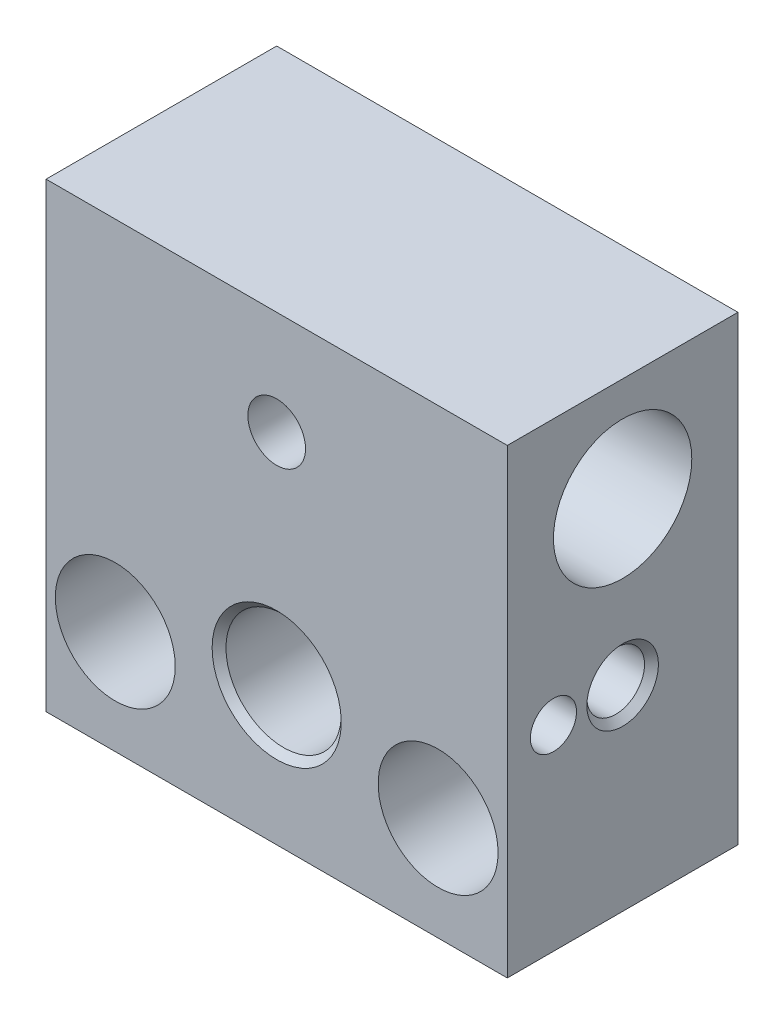
ISO-10303-21;
HEADER;
FILE_DESCRIPTION(('STEP AP214'),'2;1');
FILE_NAME('part.step','',(''),(''),'','','');
FILE_SCHEMA(('AUTOMOTIVE_DESIGN { 1 0 10303 214 1 1 1 1 }'));
ENDSEC;
DATA;
#1=APPLICATION_CONTEXT('core data for automotive mechanical design processes');
#2=APPLICATION_PROTOCOL_DEFINITION('international standard','automotive_design',2000,#1);
#3=PRODUCT_CONTEXT('',#1,'mechanical');
#4=PRODUCT('Part','Part','',(#3));
#5=PRODUCT_RELATED_PRODUCT_CATEGORY('part','',(#4));
#6=PRODUCT_DEFINITION_FORMATION('','',#4);
#7=PRODUCT_DEFINITION_CONTEXT('part definition',#1,'design');
#8=PRODUCT_DEFINITION('design','',#6,#7);
#9=PRODUCT_DEFINITION_SHAPE('','',#8);
#10=(LENGTH_UNIT() NAMED_UNIT(*) SI_UNIT(.MILLI.,.METRE.));
#11=(NAMED_UNIT(*) PLANE_ANGLE_UNIT() SI_UNIT($,.RADIAN.));
#12=(NAMED_UNIT(*) SI_UNIT($,.STERADIAN.) SOLID_ANGLE_UNIT());
#13=UNCERTAINTY_MEASURE_WITH_UNIT(LENGTH_MEASURE(1.E-05),#10,'distance_accuracy_value','');
#14=(GEOMETRIC_REPRESENTATION_CONTEXT(3) GLOBAL_UNCERTAINTY_ASSIGNED_CONTEXT((#13)) GLOBAL_UNIT_ASSIGNED_CONTEXT((#10,
#11,#12)) REPRESENTATION_CONTEXT('',''));
#15=CARTESIAN_POINT('',(0.,0.,0.));
#16=DIRECTION('',(0.,0.,1.));
#17=DIRECTION('',(1.,0.,0.));
#18=AXIS2_PLACEMENT_3D('',#15,#16,#17);
#19=CARTESIAN_POINT('',(10.,-10.,5.));
#20=DIRECTION('',(-1.,0.,0.));
#21=DIRECTION('',(0.,0.,1.));
#22=AXIS2_PLACEMENT_3D('',#19,#20,#21);
#23=PLANE('',#22);
#24=CARTESIAN_POINT('',(10.,-1.5,0.));
#25=DIRECTION('',(-1.,0.,0.));
#26=DIRECTION('',(0.,0.,1.));
#27=AXIS2_PLACEMENT_3D('',#24,#25,#26);
#28=CIRCLE('',#27,1.55);
#29=CARTESIAN_POINT('',(10.,-1.5,1.55));
#30=VERTEX_POINT('',#29);
#31=EDGE_CURVE('E12',#30,#30,#28,.T.);
#32=ORIENTED_EDGE('',*,*,#31,.T.);
#33=EDGE_LOOP('',(#32));
#34=FACE_BOUND('',#33,.T.);
#35=CARTESIAN_POINT('',(10.,-1.5,3.));
#36=DIRECTION('',(1.,0.,0.));
#37=DIRECTION('',(0.,0.,-1.));
#38=AXIS2_PLACEMENT_3D('',#35,#36,#37);
#39=CIRCLE('',#38,1.);
#40=CARTESIAN_POINT('',(10.,-1.5,2.));
#41=VERTEX_POINT('',#40);
#42=EDGE_CURVE('E85',#41,#41,#39,.T.);
#43=ORIENTED_EDGE('',*,*,#42,.F.);
#44=EDGE_LOOP('',(#43));
#45=FACE_BOUND('',#44,.T.);
#46=CARTESIAN_POINT('',(10.,5.5,0.));
#47=DIRECTION('',(1.,0.,0.));
#48=DIRECTION('',(0.,0.,-1.));
#49=AXIS2_PLACEMENT_3D('',#46,#47,#48);
#50=CIRCLE('',#49,3.);
#51=CARTESIAN_POINT('',(10.,5.5,-3.));
#52=VERTEX_POINT('',#51);
#53=EDGE_CURVE('E94',#52,#52,#50,.T.);
#54=ORIENTED_EDGE('',*,*,#53,.F.);
#55=EDGE_LOOP('',(#54));
#56=FACE_BOUND('',#55,.T.);
#57=DIRECTION('',(0.,1.,0.));
#58=VECTOR('',#57,1.);
#59=CARTESIAN_POINT('',(10.,-10.,-5.));
#60=LINE('',#59,#58);
#61=CARTESIAN_POINT('',(10.,-10.,-5.));
#62=VERTEX_POINT('',#61);
#63=CARTESIAN_POINT('',(10.,10.,-5.));
#64=VERTEX_POINT('',#63);
#65=EDGE_CURVE('E97',#62,#64,#60,.T.);
#66=ORIENTED_EDGE('',*,*,#65,.T.);
#67=DIRECTION('',(0.,0.,-1.));
#68=VECTOR('',#67,1.);
#69=CARTESIAN_POINT('',(10.,10.,5.));
#70=LINE('',#69,#68);
#71=CARTESIAN_POINT('',(10.,10.,5.));
#72=VERTEX_POINT('',#71);
#73=EDGE_CURVE('E120',#72,#64,#70,.T.);
#74=ORIENTED_EDGE('',*,*,#73,.F.);
#75=DIRECTION('',(0.,1.,0.));
#76=VECTOR('',#75,1.);
#77=CARTESIAN_POINT('',(10.,-10.,5.));
#78=LINE('',#77,#76);
#79=CARTESIAN_POINT('',(10.,-10.,5.));
#80=VERTEX_POINT('',#79);
#81=EDGE_CURVE('E105',#80,#72,#78,.T.);
#82=ORIENTED_EDGE('',*,*,#81,.F.);
#83=DIRECTION('',(0.,0.,-1.));
#84=VECTOR('',#83,1.);
#85=CARTESIAN_POINT('',(10.,-10.,5.));
#86=LINE('',#85,#84);
#87=EDGE_CURVE('E107',#80,#62,#86,.T.);
#88=ORIENTED_EDGE('',*,*,#87,.T.);
#89=EDGE_LOOP('',(#66,#74,#82,#88));
#90=FACE_BOUND('',#89,.T.);
#91=ADVANCED_FACE('F19',(#34,#45,#56,#90),#23,.F.);
#92=CARTESIAN_POINT('',(-10.,10.,5.));
#93=DIRECTION('',(0.,-1.,0.));
#94=DIRECTION('',(0.,0.,-1.));
#95=AXIS2_PLACEMENT_3D('',#92,#93,#94);
#96=PLANE('',#95);
#97=DIRECTION('',(-1.,0.,0.));
#98=VECTOR('',#97,1.);
#99=CARTESIAN_POINT('',(-10.,10.,-5.));
#100=LINE('',#99,#98);
#101=CARTESIAN_POINT('',(-10.,10.,-5.));
#102=VERTEX_POINT('',#101);
#103=EDGE_CURVE('E112',#64,#102,#100,.T.);
#104=ORIENTED_EDGE('',*,*,#103,.T.);
#105=DIRECTION('',(0.,0.,-1.));
#106=VECTOR('',#105,1.);
#107=CARTESIAN_POINT('',(-10.,10.,5.));
#108=LINE('',#107,#106);
#109=CARTESIAN_POINT('',(-10.,10.,5.));
#110=VERTEX_POINT('',#109);
#111=EDGE_CURVE('E119',#110,#102,#108,.T.);
#112=ORIENTED_EDGE('',*,*,#111,.F.);
#113=DIRECTION('',(-1.,0.,0.));
#114=VECTOR('',#113,1.);
#115=CARTESIAN_POINT('',(-10.,10.,5.));
#116=LINE('',#115,#114);
#117=EDGE_CURVE('E70',#72,#110,#116,.T.);
#118=ORIENTED_EDGE('',*,*,#117,.F.);
#119=ORIENTED_EDGE('',*,*,#73,.T.);
#120=EDGE_LOOP('',(#104,#112,#118,#119));
#121=FACE_BOUND('',#120,.T.);
#122=ADVANCED_FACE('F157',(#121),#96,.F.);
#123=CARTESIAN_POINT('',(-10.,-10.,5.));
#124=DIRECTION('',(1.,0.,0.));
#125=DIRECTION('',(0.,0.,-1.));
#126=AXIS2_PLACEMENT_3D('',#123,#124,#125);
#127=PLANE('',#126);
#128=CARTESIAN_POINT('',(-10.,5.5,0.));
#129=DIRECTION('',(1.,0.,0.));
#130=DIRECTION('',(0.,0.,-1.));
#131=AXIS2_PLACEMENT_3D('',#128,#129,#130);
#132=CIRCLE('',#131,3.);
#133=CARTESIAN_POINT('',(-10.,5.5,-3.));
#134=VERTEX_POINT('',#133);
#135=EDGE_CURVE('E96',#134,#134,#132,.T.);
#136=ORIENTED_EDGE('',*,*,#135,.T.);
#137=EDGE_LOOP('',(#136));
#138=FACE_BOUND('',#137,.T.);
#139=DIRECTION('',(0.,-1.,0.));
#140=VECTOR('',#139,1.);
#141=CARTESIAN_POINT('',(-10.,-10.,-5.));
#142=LINE('',#141,#140);
#143=CARTESIAN_POINT('',(-10.,-10.,-5.));
#144=VERTEX_POINT('',#143);
#145=EDGE_CURVE('E53',#102,#144,#142,.T.);
#146=ORIENTED_EDGE('',*,*,#145,.T.);
#147=DIRECTION('',(0.,0.,-1.));
#148=VECTOR('',#147,1.);
#149=CARTESIAN_POINT('',(-10.,-10.,5.));
#150=LINE('',#149,#148);
#151=CARTESIAN_POINT('',(-10.,-10.,5.));
#152=VERTEX_POINT('',#151);
#153=EDGE_CURVE('E116',#152,#144,#150,.T.);
#154=ORIENTED_EDGE('',*,*,#153,.F.);
#155=DIRECTION('',(0.,-1.,0.));
#156=VECTOR('',#155,1.);
#157=CARTESIAN_POINT('',(-10.,-10.,5.));
#158=LINE('',#157,#156);
#159=EDGE_CURVE('E104',#110,#152,#158,.T.);
#160=ORIENTED_EDGE('',*,*,#159,.F.);
#161=ORIENTED_EDGE('',*,*,#111,.T.);
#162=EDGE_LOOP('',(#146,#154,#160,#161));
#163=FACE_BOUND('',#162,.T.);
#164=ADVANCED_FACE('F167',(#138,#163),#127,.F.);
#165=CARTESIAN_POINT('',(-10.,-10.,5.));
#166=DIRECTION('',(0.,1.,0.));
#167=DIRECTION('',(0.,0.,1.));
#168=AXIS2_PLACEMENT_3D('',#165,#166,#167);
#169=PLANE('',#168);
#170=DIRECTION('',(1.,0.,0.));
#171=VECTOR('',#170,1.);
#172=CARTESIAN_POINT('',(-10.,-10.,-5.));
#173=LINE('',#172,#171);
#174=EDGE_CURVE('E58',#144,#62,#173,.T.);
#175=ORIENTED_EDGE('',*,*,#174,.T.);
#176=ORIENTED_EDGE('',*,*,#87,.F.);
#177=DIRECTION('',(1.,0.,0.));
#178=VECTOR('',#177,1.);
#179=CARTESIAN_POINT('',(-10.,-10.,5.));
#180=LINE('',#179,#178);
#181=EDGE_CURVE('E38',#152,#80,#180,.T.);
#182=ORIENTED_EDGE('',*,*,#181,.F.);
#183=ORIENTED_EDGE('',*,*,#153,.T.);
#184=EDGE_LOOP('',(#175,#176,#182,#183));
#185=FACE_BOUND('',#184,.T.);
#186=ADVANCED_FACE('F214',(#185),#169,.F.);
#187=CARTESIAN_POINT('',(0.,0.,5.));
#188=DIRECTION('',(0.,0.,-1.));
#189=DIRECTION('',(-1.,0.,0.));
#190=AXIS2_PLACEMENT_3D('',#187,#188,#189);
#191=PLANE('',#190);
#192=CARTESIAN_POINT('',(0.,5.5,5.));
#193=DIRECTION('',(0.,0.,1.));
#194=DIRECTION('',(1.,0.,0.));
#195=AXIS2_PLACEMENT_3D('',#192,#193,#194);
#196=CIRCLE('',#195,1.25);
#197=CARTESIAN_POINT('',(1.25,5.5,5.));
#198=VERTEX_POINT('',#197);
#199=EDGE_CURVE('E345',#198,#198,#196,.T.);
#200=ORIENTED_EDGE('',*,*,#199,.F.);
#201=EDGE_LOOP('',(#200));
#202=FACE_BOUND('',#201,.T.);
#203=CARTESIAN_POINT('',(0.,-4.,5.));
#204=DIRECTION('',(0.,0.,-1.));
#205=DIRECTION('',(-1.,0.,0.));
#206=AXIS2_PLACEMENT_3D('',#203,#204,#205);
#207=CIRCLE('',#206,2.8);
#208=CARTESIAN_POINT('',(-2.8,-4.,5.));
#209=VERTEX_POINT('',#208);
#210=EDGE_CURVE('E121',#209,#209,#207,.T.);
#211=ORIENTED_EDGE('',*,*,#210,.T.);
#212=EDGE_LOOP('',(#211));
#213=FACE_BOUND('',#212,.T.);
#214=CARTESIAN_POINT('',(7.,-5.5,5.));
#215=DIRECTION('',(0.,0.,1.));
#216=DIRECTION('',(1.,0.,0.));
#217=AXIS2_PLACEMENT_3D('',#214,#215,#216);
#218=CIRCLE('',#217,2.6);
#219=CARTESIAN_POINT('',(9.6,-5.5,5.));
#220=VERTEX_POINT('',#219);
#221=EDGE_CURVE('E350',#220,#220,#218,.T.);
#222=ORIENTED_EDGE('',*,*,#221,.F.);
#223=EDGE_LOOP('',(#222));
#224=FACE_BOUND('',#223,.T.);
#225=CARTESIAN_POINT('',(-7.,-5.5,5.));
#226=DIRECTION('',(0.,0.,1.));
#227=DIRECTION('',(1.,0.,0.));
#228=AXIS2_PLACEMENT_3D('',#225,#226,#227);
#229=CIRCLE('',#228,2.6);
#230=CARTESIAN_POINT('',(-4.4,-5.5,5.));
#231=VERTEX_POINT('',#230);
#232=EDGE_CURVE('E129',#231,#231,#229,.T.);
#233=ORIENTED_EDGE('',*,*,#232,.F.);
#234=EDGE_LOOP('',(#233));
#235=FACE_BOUND('',#234,.T.);
#236=ORIENTED_EDGE('',*,*,#81,.T.);
#237=ORIENTED_EDGE('',*,*,#117,.T.);
#238=ORIENTED_EDGE('',*,*,#159,.T.);
#239=ORIENTED_EDGE('',*,*,#181,.T.);
#240=EDGE_LOOP('',(#236,#237,#238,#239));
#241=FACE_BOUND('',#240,.T.);
#242=ADVANCED_FACE('F215',(#202,#213,#224,#235,#241),#191,.F.);
#243=CARTESIAN_POINT('',(0.,0.,-5.));
#244=DIRECTION('',(0.,0.,-1.));
#245=DIRECTION('',(-1.,0.,0.));
#246=AXIS2_PLACEMENT_3D('',#243,#244,#245);
#247=PLANE('',#246);
#248=CARTESIAN_POINT('',(0.,-4.,-5.));
#249=DIRECTION('',(0.,0.,-1.));
#250=DIRECTION('',(-1.,0.,0.));
#251=AXIS2_PLACEMENT_3D('',#248,#249,#250);
#252=CIRCLE('',#251,2.8);
#253=CARTESIAN_POINT('',(-2.8,-4.,-5.));
#254=VERTEX_POINT('',#253);
#255=EDGE_CURVE('E138',#254,#254,#252,.F.);
#256=ORIENTED_EDGE('',*,*,#255,.T.);
#257=EDGE_LOOP('',(#256));
#258=FACE_BOUND('',#257,.T.);
#259=CARTESIAN_POINT('',(-7.,-5.5,-5.));
#260=DIRECTION('',(0.,0.,-1.));
#261=DIRECTION('',(-1.,0.,0.));
#262=AXIS2_PLACEMENT_3D('',#259,#260,#261);
#263=CIRCLE('',#262,1.25);
#264=CARTESIAN_POINT('',(-8.25,-5.5,-5.));
#265=VERTEX_POINT('',#264);
#266=EDGE_CURVE('E90',#265,#265,#263,.T.);
#267=ORIENTED_EDGE('',*,*,#266,.F.);
#268=EDGE_LOOP('',(#267));
#269=FACE_BOUND('',#268,.T.);
#270=CARTESIAN_POINT('',(7.,-5.5,-5.));
#271=DIRECTION('',(0.,0.,-1.));
#272=DIRECTION('',(-1.,0.,0.));
#273=AXIS2_PLACEMENT_3D('',#270,#271,#272);
#274=CIRCLE('',#273,1.25);
#275=CARTESIAN_POINT('',(5.75,-5.5,-5.));
#276=VERTEX_POINT('',#275);
#277=EDGE_CURVE('E84',#276,#276,#274,.T.);
#278=ORIENTED_EDGE('',*,*,#277,.F.);
#279=EDGE_LOOP('',(#278));
#280=FACE_BOUND('',#279,.T.);
#281=ORIENTED_EDGE('',*,*,#65,.F.);
#282=ORIENTED_EDGE('',*,*,#174,.F.);
#283=ORIENTED_EDGE('',*,*,#145,.F.);
#284=ORIENTED_EDGE('',*,*,#103,.F.);
#285=EDGE_LOOP('',(#281,#282,#283,#284));
#286=FACE_BOUND('',#285,.T.);
#287=ADVANCED_FACE('F209',(#258,#269,#280,#286),#247,.T.);
#288=CARTESIAN_POINT('',(-10.,5.5,0.));
#289=DIRECTION('',(1.,0.,0.));
#290=DIRECTION('',(0.,0.,-1.));
#291=AXIS2_PLACEMENT_3D('',#288,#289,#290);
#292=CYLINDRICAL_SURFACE('',#291,3.);
#293=CARTESIAN_POINT('',(1.25,5.5,3.));
#294=CARTESIAN_POINT('',(1.2499927949087,5.43304194736373,2.99999458367272));
#295=CARTESIAN_POINT('',(1.24458804147187,5.36597860293616,2.9977323297471));
#296=CARTESIAN_POINT('',(1.22316093507982,5.23375262884365,2.98890153579552));
#297=CARTESIAN_POINT('',(1.20711087553575,5.16859542357643,2.98232175901028));
#298=CARTESIAN_POINT('',(1.16508890821941,5.04231126634691,2.96556289038127));
#299=CARTESIAN_POINT('',(1.13915061053185,4.98117147557373,2.95539599975004));
#300=CARTESIAN_POINT('',(1.07822717676743,4.8641702433202,2.93245286470664));
#301=CARTESIAN_POINT('',(1.04324478102913,4.80830720998406,2.91967741092849));
#302=CARTESIAN_POINT('',(0.963371017409121,4.70055159644049,2.89207828351869));
#303=CARTESIAN_POINT('',(0.918098691210249,4.64895873248223,2.87718753326093));
#304=CARTESIAN_POINT('',(0.819735665217432,4.55384017890874,2.84732714068513));
#305=CARTESIAN_POINT('',(0.766640875105495,4.51031873684691,2.83235746106809));
#306=CARTESIAN_POINT('',(0.650973222435108,4.43046262302934,2.80321021812995));
#307=CARTESIAN_POINT('',(0.588062551573458,4.39458691846075,2.78910786873385));
#308=CARTESIAN_POINT('',(0.456426742079071,4.33406059411134,2.76435572357005));
#309=CARTESIAN_POINT('',(0.387704620515549,4.30940419163709,2.75370415000823));
#310=CARTESIAN_POINT('',(0.24984630823208,4.27325401687841,2.73778555387705));
#311=CARTESIAN_POINT('',(0.180889516607847,4.26118342122394,2.73228387651787));
#312=CARTESIAN_POINT('',(0.0417267073134302,4.24874790032203,2.72661326219504));
#313=CARTESIAN_POINT('',(-0.0284786000257391,4.24837651945603,2.7264413842526));
#314=CARTESIAN_POINT('',(-0.162400060434937,4.25891549636326,2.73125119560853));
#315=CARTESIAN_POINT('',(-0.226201096564461,4.26896318887699,2.73583882723623));
#316=CARTESIAN_POINT('',(-0.351112091000389,4.29860808984223,2.74898482773796));
#317=CARTESIAN_POINT('',(-0.412221531491772,4.31820712712823,2.75754395703563));
#318=CARTESIAN_POINT('',(-0.531557702991441,4.36678041272429,2.77786184772756));
#319=CARTESIAN_POINT('',(-0.589695420913378,4.39594528460764,2.78968481949136));
#320=CARTESIAN_POINT('',(-0.700477733880146,4.46268757419437,2.81518331141086));
#321=CARTESIAN_POINT('',(-0.753120150613517,4.50026830948045,2.82885956129779));
#322=CARTESIAN_POINT('',(-0.856099958732839,4.58650403445616,2.85792976877979));
#323=CARTESIAN_POINT('',(-0.905866567385437,4.63582651679247,2.87337121404473));
#324=CARTESIAN_POINT('',(-0.996613502959182,4.74227040894849,2.90325673112529));
#325=CARTESIAN_POINT('',(-1.03759177169218,4.79939364055155,2.9177005687701));
#326=CARTESIAN_POINT('',(-1.11043582361627,4.92155205130663,2.94438283556473));
#327=CARTESIAN_POINT('',(-1.14206944515068,4.98673941755232,2.95656266543334));
#328=CARTESIAN_POINT('',(-1.19372113960326,5.12214759747317,2.97689481414803));
#329=CARTESIAN_POINT('',(-1.21374563194382,5.19236560520497,2.985049358458));
#330=CARTESIAN_POINT('',(-1.24041599212664,5.33107188665377,2.99599641186385));
#331=CARTESIAN_POINT('',(-1.24782785744375,5.39938871472136,2.99909541047125));
#332=CARTESIAN_POINT('',(-1.25134622361409,5.53635465549609,3.00056050368745));
#333=CARTESIAN_POINT('',(-1.247455970252,5.60500366715264,2.99892795711939));
#334=CARTESIAN_POINT('',(-1.22902891519393,5.73709824234144,2.9913121765694));
#335=CARTESIAN_POINT('',(-1.2150300459028,5.80063296663939,2.98554887283989));
#336=CARTESIAN_POINT('',(-1.17753180545922,5.9243827489711,2.97048606772414));
#337=CARTESIAN_POINT('',(-1.1540312340497,5.98459738651837,2.96118611959704));
#338=CARTESIAN_POINT('',(-1.09742902428788,6.10210899986914,2.93958270645166));
#339=CARTESIAN_POINT('',(-1.06405181685397,6.15925723685533,2.92719491469281));
#340=CARTESIAN_POINT('',(-0.988946622208303,6.26734621623143,2.9007380457909));
#341=CARTESIAN_POINT('',(-0.947215148470727,6.31828435260194,2.88666826768733));
#342=CARTESIAN_POINT('',(-0.853096766727593,6.41633343027427,2.85712087895437));
#343=CARTESIAN_POINT('',(-0.800161497013737,6.46291069797984,2.84161451591029));
#344=CARTESIAN_POINT('',(-0.686978724064606,6.54666984610551,2.81184336768005));
#345=CARTESIAN_POINT('',(-0.626729564828268,6.58384959285618,2.79757886493438));
#346=CARTESIAN_POINT('',(-0.499385824697425,6.648159602087,2.77181386243988));
#347=CARTESIAN_POINT('',(-0.432205964485168,6.67513918237329,2.76035562555111));
#348=CARTESIAN_POINT('',(-0.293629406189892,6.71717413951573,2.74208355658957));
#349=CARTESIAN_POINT('',(-0.222236237516652,6.73223934863688,2.73526589555752));
#350=CARTESIAN_POINT('',(-0.0831813008007919,6.74904080348901,2.72763164537264));
#351=CARTESIAN_POINT('',(-0.0156553377073856,6.75171380413129,2.72639350967163));
#352=CARTESIAN_POINT('',(0.118842861141101,6.74615575523912,2.72893853011024));
#353=CARTESIAN_POINT('',(0.185815180313694,6.73792637964721,2.73272091540307));
#354=CARTESIAN_POINT('',(0.314092747468889,6.71158404780491,2.74449551302268));
#355=CARTESIAN_POINT('',(0.375516673463391,6.69394903571466,2.7522835484648));
#356=CARTESIAN_POINT('',(0.494548021357227,6.64976328202135,2.77103181199189));
#357=CARTESIAN_POINT('',(0.552154365398783,6.62321003517252,2.78199293131693));
#358=CARTESIAN_POINT('',(0.665695895949124,6.5601028593549,2.80666954560013));
#359=CARTESIAN_POINT('',(0.721322330168289,6.52304360910483,2.82051102713679));
#360=CARTESIAN_POINT('',(0.825860139360679,6.44068407263039,2.84903689053839));
#361=CARTESIAN_POINT('',(0.874769175600573,6.39538092890562,2.86372156345875));
#362=CARTESIAN_POINT('',(0.968148681684745,6.29390204577882,2.89356392850106));
#363=CARTESIAN_POINT('',(1.01203643284065,6.23717473994903,2.90867817511791));
#364=CARTESIAN_POINT('',(1.08969945354363,6.1166000792532,2.9366014362202));
#365=CARTESIAN_POINT('',(1.12347011488955,6.05274949794575,2.94940939916741));
#366=CARTESIAN_POINT('',(1.17920984543989,5.92073205671795,2.97109183362461));
#367=CARTESIAN_POINT('',(1.2013647666173,5.85265399098064,2.98002782581964));
#368=CARTESIAN_POINT('',(1.23370632907784,5.71341042184656,2.99321009768625));
#369=CARTESIAN_POINT('',(1.24393044252989,5.64225531698096,2.99747105811967));
#370=CARTESIAN_POINT('',(1.24933316108645,5.54723608191919,2.99972287568934));
#371=CARTESIAN_POINT('',(1.25000254214922,5.52362459467566,3.00000191102536));
#372=CARTESIAN_POINT('',(1.25,5.5,3.));
#373=B_SPLINE_CURVE_WITH_KNOTS('',3,(#293,#294,#295,#296,#297,#298,#299,#300,#301,#302,#303,
#304,#305,#306,#307,#308,#309,#310,#311,#312,#313,#314,#315,#316,#317,#318,#319,#320,#321,#322,
#323,#324,#325,#326,#327,#328,#329,#330,#331,#332,#333,#334,#335,#336,#337,#338,#339,#340,#341,
#342,#343,#344,#345,#346,#347,#348,#349,#350,#351,#352,#353,#354,#355,#356,#357,#358,#359,#360,
#361,#362,#363,#364,#365,#366,#367,#368,#369,#370,#371,#372),.UNSPECIFIED.,.T.,.F.,(4,2,2,2,2,2,
2,2,2,2,2,2,2,2,2,2,2,2,2,2,2,2,2,2,2,2,2,2,2,2,2,2,2,2,2,2,2,2,2,4),(0.,0.200806918883941,
0.402138540628699,0.602791851906302,0.803384436852974,1.01317936288807,1.22308438131465,
1.44331724539125,1.66343646730588,1.87295273137558,2.08235338249046,2.27570157202557,
2.46908679727213,2.66658713058715,2.86416545717206,3.07844141127897,3.29276749314589,
3.51204055060814,3.73119224218298,3.93648443393252,4.14171767493173,4.33676589735722,
4.53183876601786,4.73297135272162,4.93418805469496,5.14978488029295,5.36543061240342,
5.58414788359524,5.80268447074581,6.00439877559644,6.20608211297537,6.39837649964763,
6.59072494950613,6.79463893397442,6.99862373425945,7.2174653500489,7.43640649428583,
7.65172855819386,7.86637250469322,7.93722256499099),.UNSPECIFIED.);
#374=CARTESIAN_POINT('',(1.25,5.5,3.));
#375=VERTEX_POINT('',#374);
#376=EDGE_CURVE('E337',#375,#375,#373,.T.);
#377=ORIENTED_EDGE('',*,*,#376,.F.);
#378=EDGE_LOOP('',(#377));
#379=FACE_BOUND('',#378,.T.);
#380=ORIENTED_EDGE('',*,*,#135,.F.);
#381=EDGE_LOOP('',(#380));
#382=FACE_BOUND('',#381,.T.);
#383=ORIENTED_EDGE('',*,*,#53,.T.);
#384=EDGE_LOOP('',(#383));
#385=FACE_BOUND('',#384,.T.);
#386=ADVANCED_FACE('F206',(#379,#382,#385),#292,.F.);
#387=CARTESIAN_POINT('',(5.,-1.5,3.));
#388=DIRECTION('',(1.,0.,0.));
#389=DIRECTION('',(0.,0.,-1.));
#390=AXIS2_PLACEMENT_3D('',#387,#388,#389);
#391=CYLINDRICAL_SURFACE('',#390,1.);
#392=CARTESIAN_POINT('',(5.,-1.5,3.));
#393=DIRECTION('',(1.,0.,0.));
#394=DIRECTION('',(0.,0.,-1.));
#395=AXIS2_PLACEMENT_3D('',#392,#393,#394);
#396=CIRCLE('',#395,1.);
#397=CARTESIAN_POINT('',(5.,-1.5,2.));
#398=VERTEX_POINT('',#397);
#399=EDGE_CURVE('E88',#398,#398,#396,.T.);
#400=ORIENTED_EDGE('',*,*,#399,.F.);
#401=EDGE_LOOP('',(#400));
#402=FACE_BOUND('',#401,.T.);
#403=ORIENTED_EDGE('',*,*,#42,.T.);
#404=EDGE_LOOP('',(#403));
#405=FACE_BOUND('',#404,.T.);
#406=ADVANCED_FACE('F205',(#402,#405),#391,.F.);
#407=CARTESIAN_POINT('',(5.,-1.5,3.));
#408=DIRECTION('',(1.,0.,0.));
#409=DIRECTION('',(0.,0.,-1.));
#410=AXIS2_PLACEMENT_3D('',#407,#408,#409);
#411=PLANE('',#410);
#412=ORIENTED_EDGE('',*,*,#399,.T.);
#413=EDGE_LOOP('',(#412));
#414=FACE_BOUND('',#413,.T.);
#415=ADVANCED_FACE('F76',(#414),#411,.T.);
#416=CARTESIAN_POINT('',(5.,-1.5,0.));
#417=DIRECTION('',(1.,0.,0.));
#418=DIRECTION('',(0.,0.,-1.));
#419=AXIS2_PLACEMENT_3D('',#416,#417,#418);
#420=CONICAL_SURFACE('',#419,1.25,1.02974425867665);
#421=CARTESIAN_POINT('',(4.24892422621555,-1.5,0.));
#422=VERTEX_POINT('',#421);
#423=VERTEX_LOOP('',#422);
#424=FACE_BOUND('',#423,.T.);
#425=CARTESIAN_POINT('',(5.,-1.5,0.));
#426=DIRECTION('',(1.,0.,0.));
#427=DIRECTION('',(0.,0.,-1.));
#428=AXIS2_PLACEMENT_3D('',#425,#426,#427);
#429=CIRCLE('',#428,1.25);
#430=CARTESIAN_POINT('',(5.,-1.5,-1.25));
#431=VERTEX_POINT('',#430);
#432=EDGE_CURVE('E79',#431,#431,#429,.T.);
#433=ORIENTED_EDGE('',*,*,#432,.T.);
#434=EDGE_LOOP('',(#433));
#435=FACE_BOUND('',#434,.T.);
#436=ADVANCED_FACE('F71',(#424,#435),#420,.F.);
#437=CARTESIAN_POINT('',(10.,-1.5,0.));
#438=DIRECTION('',(1.,0.,0.));
#439=DIRECTION('',(0.,0.,-1.));
#440=AXIS2_PLACEMENT_3D('',#437,#438,#439);
#441=CYLINDRICAL_SURFACE('',#440,1.25);
#442=CARTESIAN_POINT('',(9.7,-1.5,0.));
#443=DIRECTION('',(-1.,0.,0.));
#444=DIRECTION('',(0.,0.,1.));
#445=AXIS2_PLACEMENT_3D('',#442,#443,#444);
#446=CIRCLE('',#445,1.25);
#447=CARTESIAN_POINT('',(9.7,-1.5,1.25));
#448=VERTEX_POINT('',#447);
#449=EDGE_CURVE('E29',#448,#448,#446,.F.);
#450=ORIENTED_EDGE('',*,*,#449,.T.);
#451=EDGE_LOOP('',(#450));
#452=FACE_BOUND('',#451,.T.);
#453=ORIENTED_EDGE('',*,*,#432,.F.);
#454=EDGE_LOOP('',(#453));
#455=FACE_BOUND('',#454,.T.);
#456=ADVANCED_FACE('F74',(#452,#455),#441,.F.);
#457=CARTESIAN_POINT('',(0.,-4.,5.));
#458=DIRECTION('',(0.,0.,-1.));
#459=DIRECTION('',(-1.,0.,0.));
#460=AXIS2_PLACEMENT_3D('',#457,#458,#459);
#461=CYLINDRICAL_SURFACE('',#460,2.5);
#462=CARTESIAN_POINT('',(0.,-4.,4.7));
#463=DIRECTION('',(0.,0.,-1.));
#464=DIRECTION('',(-1.,0.,0.));
#465=AXIS2_PLACEMENT_3D('',#462,#463,#464);
#466=CIRCLE('',#465,2.5);
#467=CARTESIAN_POINT('',(-2.5,-4.,4.7));
#468=VERTEX_POINT('',#467);
#469=EDGE_CURVE('E140',#468,#468,#466,.F.);
#470=ORIENTED_EDGE('',*,*,#469,.T.);
#471=EDGE_LOOP('',(#470));
#472=FACE_BOUND('',#471,.T.);
#473=CARTESIAN_POINT('',(0.,-4.,-4.7));
#474=DIRECTION('',(0.,0.,-1.));
#475=DIRECTION('',(-1.,0.,0.));
#476=AXIS2_PLACEMENT_3D('',#473,#474,#475);
#477=CIRCLE('',#476,2.5);
#478=CARTESIAN_POINT('',(-2.5,-4.,-4.7));
#479=VERTEX_POINT('',#478);
#480=EDGE_CURVE('E133',#479,#479,#477,.T.);
#481=ORIENTED_EDGE('',*,*,#480,.T.);
#482=EDGE_LOOP('',(#481));
#483=FACE_BOUND('',#482,.T.);
#484=ADVANCED_FACE('F182',(#472,#483),#461,.F.);
#485=CARTESIAN_POINT('',(7.,-5.5,5.));
#486=DIRECTION('',(0.,0.,-1.));
#487=DIRECTION('',(-1.,0.,0.));
#488=AXIS2_PLACEMENT_3D('',#485,#486,#487);
#489=CYLINDRICAL_SURFACE('',#488,1.25);
#490=CARTESIAN_POINT('',(7.,-5.5,-3.));
#491=DIRECTION('',(0.,0.,-1.));
#492=DIRECTION('',(-1.,0.,0.));
#493=AXIS2_PLACEMENT_3D('',#490,#491,#492);
#494=CIRCLE('',#493,1.25);
#495=CARTESIAN_POINT('',(5.75,-5.5,-3.));
#496=VERTEX_POINT('',#495);
#497=EDGE_CURVE('E126',#496,#496,#494,.F.);
#498=ORIENTED_EDGE('',*,*,#497,.T.);
#499=EDGE_LOOP('',(#498));
#500=FACE_BOUND('',#499,.T.);
#501=ORIENTED_EDGE('',*,*,#277,.T.);
#502=EDGE_LOOP('',(#501));
#503=FACE_BOUND('',#502,.T.);
#504=ADVANCED_FACE('F186',(#500,#503),#489,.F.);
#505=CARTESIAN_POINT('',(-7.,-5.5,5.));
#506=DIRECTION('',(0.,0.,-1.));
#507=DIRECTION('',(-1.,0.,0.));
#508=AXIS2_PLACEMENT_3D('',#505,#506,#507);
#509=CYLINDRICAL_SURFACE('',#508,1.25);
#510=CARTESIAN_POINT('',(-7.,-5.5,-3.));
#511=DIRECTION('',(0.,0.,-1.));
#512=DIRECTION('',(-1.,0.,0.));
#513=AXIS2_PLACEMENT_3D('',#510,#511,#512);
#514=CIRCLE('',#513,1.25);
#515=CARTESIAN_POINT('',(-8.25,-5.5,-3.));
#516=VERTEX_POINT('',#515);
#517=EDGE_CURVE('E125',#516,#516,#514,.F.);
#518=ORIENTED_EDGE('',*,*,#517,.T.);
#519=EDGE_LOOP('',(#518));
#520=FACE_BOUND('',#519,.T.);
#521=ORIENTED_EDGE('',*,*,#266,.T.);
#522=EDGE_LOOP('',(#521));
#523=FACE_BOUND('',#522,.T.);
#524=ADVANCED_FACE('F191',(#520,#523),#509,.F.);
#525=CARTESIAN_POINT('',(0.,0.,-3.));
#526=DIRECTION('',(0.,0.,-1.));
#527=DIRECTION('',(-1.,0.,0.));
#528=AXIS2_PLACEMENT_3D('',#525,#526,#527);
#529=PLANE('',#528);
#530=CARTESIAN_POINT('',(-7.,-5.5,-3.));
#531=DIRECTION('',(0.,0.,-1.));
#532=DIRECTION('',(-1.,0.,0.));
#533=AXIS2_PLACEMENT_3D('',#530,#531,#532);
#534=CIRCLE('',#533,2.6);
#535=CARTESIAN_POINT('',(-9.6,-5.5,-3.));
#536=VERTEX_POINT('',#535);
#537=EDGE_CURVE('E130',#536,#536,#534,.F.);
#538=ORIENTED_EDGE('',*,*,#537,.T.);
#539=EDGE_LOOP('',(#538));
#540=FACE_BOUND('',#539,.T.);
#541=ORIENTED_EDGE('',*,*,#517,.F.);
#542=EDGE_LOOP('',(#541));
#543=FACE_BOUND('',#542,.T.);
#544=ADVANCED_FACE('F318',(#540,#543),#529,.F.);
#545=CARTESIAN_POINT('',(-7.,-5.5,-12.3539105243401));
#546=DIRECTION('',(0.,0.,1.));
#547=DIRECTION('',(1.,0.,0.));
#548=AXIS2_PLACEMENT_3D('',#545,#546,#547);
#549=CYLINDRICAL_SURFACE('',#548,2.6);
#550=ORIENTED_EDGE('',*,*,#232,.T.);
#551=EDGE_LOOP('',(#550));
#552=FACE_BOUND('',#551,.T.);
#553=ORIENTED_EDGE('',*,*,#537,.F.);
#554=EDGE_LOOP('',(#553));
#555=FACE_BOUND('',#554,.T.);
#556=ADVANCED_FACE('F309',(#552,#555),#549,.F.);
#557=CARTESIAN_POINT('',(0.,0.,-3.));
#558=DIRECTION('',(0.,0.,-1.));
#559=DIRECTION('',(-1.,0.,0.));
#560=AXIS2_PLACEMENT_3D('',#557,#558,#559);
#561=PLANE('',#560);
#562=CARTESIAN_POINT('',(7.,-5.5,-3.));
#563=DIRECTION('',(0.,0.,-1.));
#564=DIRECTION('',(-1.,0.,0.));
#565=AXIS2_PLACEMENT_3D('',#562,#563,#564);
#566=CIRCLE('',#565,2.6);
#567=CARTESIAN_POINT('',(4.4,-5.5,-3.));
#568=VERTEX_POINT('',#567);
#569=EDGE_CURVE('E131',#568,#568,#566,.F.);
#570=ORIENTED_EDGE('',*,*,#569,.T.);
#571=EDGE_LOOP('',(#570));
#572=FACE_BOUND('',#571,.T.);
#573=ORIENTED_EDGE('',*,*,#497,.F.);
#574=EDGE_LOOP('',(#573));
#575=FACE_BOUND('',#574,.T.);
#576=ADVANCED_FACE('F305',(#572,#575),#561,.F.);
#577=CARTESIAN_POINT('',(7.,-5.5,-12.3539105243401));
#578=DIRECTION('',(0.,0.,1.));
#579=DIRECTION('',(1.,0.,0.));
#580=AXIS2_PLACEMENT_3D('',#577,#578,#579);
#581=CYLINDRICAL_SURFACE('',#580,2.6);
#582=ORIENTED_EDGE('',*,*,#221,.T.);
#583=EDGE_LOOP('',(#582));
#584=FACE_BOUND('',#583,.T.);
#585=ORIENTED_EDGE('',*,*,#569,.F.);
#586=EDGE_LOOP('',(#585));
#587=FACE_BOUND('',#586,.T.);
#588=ADVANCED_FACE('F174',(#584,#587),#581,.F.);
#589=CARTESIAN_POINT('',(0.,-4.,5.));
#590=DIRECTION('',(0.,0.,1.));
#591=DIRECTION('',(1.,0.,0.));
#592=AXIS2_PLACEMENT_3D('',#589,#590,#591);
#593=CONICAL_SURFACE('',#592,2.8,0.785398163397446);
#594=ORIENTED_EDGE('',*,*,#469,.F.);
#595=EDGE_LOOP('',(#594));
#596=FACE_BOUND('',#595,.T.);
#597=ORIENTED_EDGE('',*,*,#210,.F.);
#598=EDGE_LOOP('',(#597));
#599=FACE_BOUND('',#598,.T.);
#600=ADVANCED_FACE('F171',(#596,#599),#593,.F.);
#601=CARTESIAN_POINT('',(0.,-4.,-4.7));
#602=DIRECTION('',(0.,0.,-1.));
#603=DIRECTION('',(-1.,0.,0.));
#604=AXIS2_PLACEMENT_3D('',#601,#602,#603);
#605=CONICAL_SURFACE('',#604,2.5,0.785398163397446);
#606=ORIENTED_EDGE('',*,*,#255,.F.);
#607=EDGE_LOOP('',(#606));
#608=FACE_BOUND('',#607,.T.);
#609=ORIENTED_EDGE('',*,*,#480,.F.);
#610=EDGE_LOOP('',(#609));
#611=FACE_BOUND('',#610,.T.);
#612=ADVANCED_FACE('F152',(#608,#611),#605,.F.);
#613=CARTESIAN_POINT('',(0.,5.5,-5.001));
#614=DIRECTION('',(0.,0.,1.));
#615=DIRECTION('',(1.,0.,0.));
#616=AXIS2_PLACEMENT_3D('',#613,#614,#615);
#617=CYLINDRICAL_SURFACE('',#616,1.25);
#618=ORIENTED_EDGE('',*,*,#199,.T.);
#619=EDGE_LOOP('',(#618));
#620=FACE_BOUND('',#619,.T.);
#621=ORIENTED_EDGE('',*,*,#376,.T.);
#622=EDGE_LOOP('',(#621));
#623=FACE_BOUND('',#622,.T.);
#624=ADVANCED_FACE('F150',(#620,#623),#617,.F.);
#625=CARTESIAN_POINT('',(9.7,-1.5,0.));
#626=DIRECTION('',(1.,0.,0.));
#627=DIRECTION('',(0.,0.,-1.));
#628=AXIS2_PLACEMENT_3D('',#625,#626,#627);
#629=CONICAL_SURFACE('',#628,1.25,0.78539816339745);
#630=ORIENTED_EDGE('',*,*,#31,.F.);
#631=EDGE_LOOP('',(#630));
#632=FACE_BOUND('',#631,.T.);
#633=ORIENTED_EDGE('',*,*,#449,.F.);
#634=EDGE_LOOP('',(#633));
#635=FACE_BOUND('',#634,.T.);
#636=ADVANCED_FACE('F21',(#632,#635),#629,.F.);
#637=CLOSED_SHELL('',(#91,#122,#164,#186,#242,#287,#386,#406,#415,#436,#456,#484,#504,#524,#544,
#556,#576,#588,#600,#612,#624,#636));
#638=MANIFOLD_SOLID_BREP('B1',#637);
#639=ADVANCED_BREP_SHAPE_REPRESENTATION('',(#18,#638),#14);
#640=SHAPE_DEFINITION_REPRESENTATION(#9,#639);
ENDSEC;
END-ISO-10303-21;
